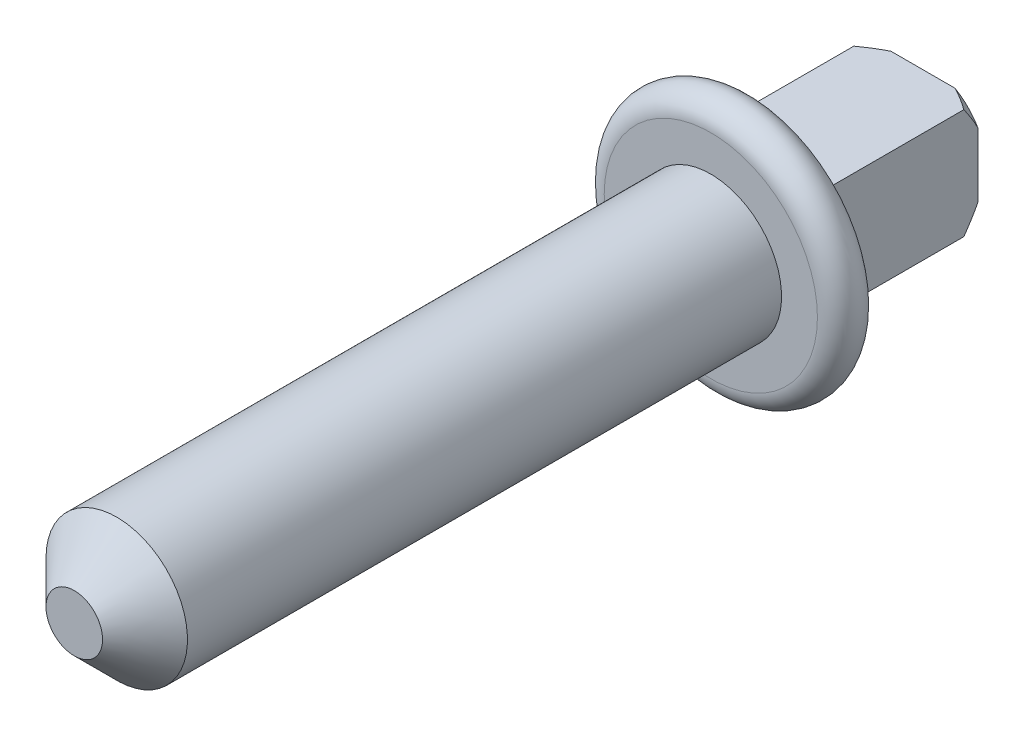
ISO-10303-21;
HEADER;
FILE_DESCRIPTION(('STEP AP214'),'2;1');
FILE_NAME('part.step','',(''),(''),'','','');
FILE_SCHEMA(('AUTOMOTIVE_DESIGN { 1 0 10303 214 1 1 1 1 }'));
ENDSEC;
DATA;
#1=APPLICATION_CONTEXT('core data for automotive mechanical design processes');
#2=APPLICATION_PROTOCOL_DEFINITION('international standard','automotive_design',2000,#1);
#3=PRODUCT_CONTEXT('',#1,'mechanical');
#4=PRODUCT('Part','Part','',(#3));
#5=PRODUCT_RELATED_PRODUCT_CATEGORY('part','',(#4));
#6=PRODUCT_DEFINITION_FORMATION('','',#4);
#7=PRODUCT_DEFINITION_CONTEXT('part definition',#1,'design');
#8=PRODUCT_DEFINITION('design','',#6,#7);
#9=PRODUCT_DEFINITION_SHAPE('','',#8);
#10=(LENGTH_UNIT() NAMED_UNIT(*) SI_UNIT(.MILLI.,.METRE.));
#11=(NAMED_UNIT(*) PLANE_ANGLE_UNIT() SI_UNIT($,.RADIAN.));
#12=(NAMED_UNIT(*) SI_UNIT($,.STERADIAN.) SOLID_ANGLE_UNIT());
#13=UNCERTAINTY_MEASURE_WITH_UNIT(LENGTH_MEASURE(1.E-05),#10,'distance_accuracy_value','');
#14=(GEOMETRIC_REPRESENTATION_CONTEXT(3) GLOBAL_UNCERTAINTY_ASSIGNED_CONTEXT((#13)) GLOBAL_UNIT_ASSIGNED_CONTEXT((#10,
#11,#12)) REPRESENTATION_CONTEXT('',''));
#15=CARTESIAN_POINT('',(0.,0.,0.));
#16=DIRECTION('',(0.,0.,1.));
#17=DIRECTION('',(1.,0.,0.));
#18=AXIS2_PLACEMENT_3D('',#15,#16,#17);
#19=CARTESIAN_POINT('',(0.,0.,1.49954257660824));
#20=DIRECTION('',(0.,0.,-1.));
#21=DIRECTION('',(-1.,0.,0.));
#22=AXIS2_PLACEMENT_3D('',#19,#20,#21);
#23=TOROIDAL_SURFACE('',#22,7.53704134094666,1.5);
#24=CARTESIAN_POINT('',(0.,0.,0.));
#25=DIRECTION('',(0.,0.,1.));
#26=DIRECTION('',(1.,0.,0.));
#27=AXIS2_PLACEMENT_3D('',#24,#25,#26);
#28=CIRCLE('',#27,7.57408268189333);
#29=CARTESIAN_POINT('',(7.57408268189333,0.,0.));
#30=VERTEX_POINT('',#29);
#31=EDGE_CURVE('E150',#30,#30,#28,.T.);
#32=ORIENTED_EDGE('',*,*,#31,.T.);
#33=EDGE_LOOP('',(#32));
#34=FACE_BOUND('',#33,.T.);
#35=CARTESIAN_POINT('',(0.,0.,2.99954257660824));
#36=DIRECTION('',(0.,0.,-1.));
#37=DIRECTION('',(-1.,0.,0.));
#38=AXIS2_PLACEMENT_3D('',#35,#36,#37);
#39=CIRCLE('',#38,7.53704134094666);
#40=CARTESIAN_POINT('',(-7.53704134094666,0.,2.99954257660824));
#41=VERTEX_POINT('',#40);
#42=EDGE_CURVE('E160',#41,#41,#39,.T.);
#43=ORIENTED_EDGE('',*,*,#42,.T.);
#44=EDGE_LOOP('',(#43));
#45=FACE_BOUND('',#44,.T.);
#46=ADVANCED_FACE('F50',(#34,#45),#23,.T.);
#47=CARTESIAN_POINT('',(0.,0.,48.));
#48=DIRECTION('',(0.,0.,-1.));
#49=DIRECTION('',(-1.,0.,0.));
#50=AXIS2_PLACEMENT_3D('',#47,#48,#49);
#51=PLANE('',#50);
#52=CARTESIAN_POINT('',(0.,0.,48.));
#53=DIRECTION('',(0.,0.,-1.));
#54=DIRECTION('',(-1.,0.,0.));
#55=AXIS2_PLACEMENT_3D('',#52,#53,#54);
#56=CIRCLE('',#55,2.00000000000001);
#57=CARTESIAN_POINT('',(-2.00000000000001,0.,48.));
#58=VERTEX_POINT('',#57);
#59=EDGE_CURVE('E169',#58,#58,#56,.T.);
#60=ORIENTED_EDGE('',*,*,#59,.F.);
#61=EDGE_LOOP('',(#60));
#62=FACE_BOUND('',#61,.T.);
#63=ADVANCED_FACE('F244',(#62),#51,.F.);
#64=CARTESIAN_POINT('',(0.,0.,48.));
#65=DIRECTION('',(0.,0.,-1.));
#66=DIRECTION('',(-1.,0.,0.));
#67=AXIS2_PLACEMENT_3D('',#64,#65,#66);
#68=CONICAL_SURFACE('',#67,2.00000000000001,0.785398163397446);
#69=CARTESIAN_POINT('',(0.,0.,45.));
#70=DIRECTION('',(0.,0.,-1.));
#71=DIRECTION('',(-1.,0.,0.));
#72=AXIS2_PLACEMENT_3D('',#69,#70,#71);
#73=CIRCLE('',#72,5.);
#74=CARTESIAN_POINT('',(-4.99999999999999,0.,45.));
#75=VERTEX_POINT('',#74);
#76=EDGE_CURVE('E166',#75,#75,#73,.T.);
#77=ORIENTED_EDGE('',*,*,#76,.F.);
#78=EDGE_LOOP('',(#77));
#79=FACE_BOUND('',#78,.T.);
#80=ORIENTED_EDGE('',*,*,#59,.T.);
#81=EDGE_LOOP('',(#80));
#82=FACE_BOUND('',#81,.T.);
#83=ADVANCED_FACE('F249',(#79,#82),#68,.T.);
#84=CARTESIAN_POINT('',(0.,0.,0.));
#85=DIRECTION('',(0.,0.,-1.));
#86=DIRECTION('',(-1.,0.,0.));
#87=AXIS2_PLACEMENT_3D('',#84,#85,#86);
#88=CYLINDRICAL_SURFACE('',#87,5.);
#89=CARTESIAN_POINT('',(0.,0.,2.99954257660824));
#90=DIRECTION('',(0.,0.,-1.));
#91=DIRECTION('',(-1.,0.,0.));
#92=AXIS2_PLACEMENT_3D('',#89,#90,#91);
#93=CIRCLE('',#92,4.99999999999999);
#94=CARTESIAN_POINT('',(-4.99999999999999,0.,2.99954257660824));
#95=VERTEX_POINT('',#94);
#96=EDGE_CURVE('E163',#95,#95,#93,.T.);
#97=ORIENTED_EDGE('',*,*,#96,.F.);
#98=EDGE_LOOP('',(#97));
#99=FACE_BOUND('',#98,.T.);
#100=ORIENTED_EDGE('',*,*,#76,.T.);
#101=EDGE_LOOP('',(#100));
#102=FACE_BOUND('',#101,.T.);
#103=ADVANCED_FACE('F259',(#99,#102),#88,.T.);
#104=CARTESIAN_POINT('',(-4.99999999999999,0.,2.99954257660824));
#105=DIRECTION('',(0.,0.,-1.));
#106=DIRECTION('',(-1.,0.,0.));
#107=AXIS2_PLACEMENT_3D('',#104,#105,#106);
#108=PLANE('',#107);
#109=ORIENTED_EDGE('',*,*,#42,.F.);
#110=EDGE_LOOP('',(#109));
#111=FACE_BOUND('',#110,.T.);
#112=ORIENTED_EDGE('',*,*,#96,.T.);
#113=EDGE_LOOP('',(#112));
#114=FACE_BOUND('',#113,.T.);
#115=ADVANCED_FACE('F255',(#111,#114),#108,.F.);
#116=CARTESIAN_POINT('',(-7.5,0.,0.));
#117=DIRECTION('',(0.,0.,1.));
#118=DIRECTION('',(1.,0.,0.));
#119=AXIS2_PLACEMENT_3D('',#116,#117,#118);
#120=PLANE('',#119);
#121=DIRECTION('',(0.,-1.,0.));
#122=VECTOR('',#121,1.);
#123=CARTESIAN_POINT('',(3.88908729652601,3.88908729652601,0.));
#124=LINE('',#123,#122);
#125=CARTESIAN_POINT('',(3.88908729652601,3.88908729652601,0.));
#126=VERTEX_POINT('',#125);
#127=CARTESIAN_POINT('',(3.88908729652601,-3.88908729652601,0.));
#128=VERTEX_POINT('',#127);
#129=EDGE_CURVE('E137',#126,#128,#124,.T.);
#130=ORIENTED_EDGE('',*,*,#129,.F.);
#131=DIRECTION('',(1.,0.,0.));
#132=VECTOR('',#131,1.);
#133=CARTESIAN_POINT('',(3.88908729652601,3.88908729652601,0.));
#134=LINE('',#133,#132);
#135=CARTESIAN_POINT('',(-3.88908729652601,3.88908729652601,0.));
#136=VERTEX_POINT('',#135);
#137=EDGE_CURVE('E74',#136,#126,#134,.T.);
#138=ORIENTED_EDGE('',*,*,#137,.F.);
#139=DIRECTION('',(0.,1.,0.));
#140=VECTOR('',#139,1.);
#141=CARTESIAN_POINT('',(-3.88908729652601,3.88908729652601,0.));
#142=LINE('',#141,#140);
#143=CARTESIAN_POINT('',(-3.88908729652601,-3.88908729652601,0.));
#144=VERTEX_POINT('',#143);
#145=EDGE_CURVE('E134',#144,#136,#142,.T.);
#146=ORIENTED_EDGE('',*,*,#145,.F.);
#147=DIRECTION('',(-1.,0.,0.));
#148=VECTOR('',#147,1.);
#149=CARTESIAN_POINT('',(3.88908729652601,-3.88908729652601,0.));
#150=LINE('',#149,#148);
#151=EDGE_CURVE('E143',#128,#144,#150,.T.);
#152=ORIENTED_EDGE('',*,*,#151,.F.);
#153=EDGE_LOOP('',(#130,#138,#146,#152));
#154=FACE_BOUND('',#153,.T.);
#155=ORIENTED_EDGE('',*,*,#31,.F.);
#156=EDGE_LOOP('',(#155));
#157=FACE_BOUND('',#156,.T.);
#158=ADVANCED_FACE('F132',(#154,#157),#120,.F.);
#159=CARTESIAN_POINT('',(3.88908729652601,3.88908729652601,25.8162189847481));
#160=DIRECTION('',(0.,1.,0.));
#161=DIRECTION('',(0.,0.,1.));
#162=AXIS2_PLACEMENT_3D('',#159,#160,#161);
#163=PLANE('',#162);
#164=DIRECTION('',(0.,0.,-1.));
#165=VECTOR('',#164,1.);
#166=CARTESIAN_POINT('',(-3.88908729652601,3.88908729652601,25.8162189847481));
#167=LINE('',#166,#165);
#168=CARTESIAN_POINT('',(-3.88908729652601,3.88908729652601,-11.));
#169=VERTEX_POINT('',#168);
#170=EDGE_CURVE('E121',#136,#169,#167,.T.);
#171=ORIENTED_EDGE('',*,*,#170,.F.);
#172=ORIENTED_EDGE('',*,*,#137,.T.);
#173=DIRECTION('',(0.,0.,-1.));
#174=VECTOR('',#173,1.);
#175=CARTESIAN_POINT('',(3.88908729652601,3.88908729652601,25.8162189847481));
#176=LINE('',#175,#174);
#177=CARTESIAN_POINT('',(3.88908729652601,3.88908729652601,-11.));
#178=VERTEX_POINT('',#177);
#179=EDGE_CURVE('E79',#126,#178,#176,.T.);
#180=ORIENTED_EDGE('',*,*,#179,.T.);
#181=CARTESIAN_POINT('',(-3.88978729652601,3.88908729652601,-10.9995050029824));
#182=CARTESIAN_POINT('',(-3.78108369336855,3.88908729652601,-11.0763519078416));
#183=CARTESIAN_POINT('',(-3.67163260877479,3.88908729652601,-11.1521649922041));
#184=CARTESIAN_POINT('',(-3.45093033281997,3.88908729652601,-11.3012287873298));
#185=CARTESIAN_POINT('',(-3.33967835451337,3.88908729652601,-11.3744783311237));
#186=CARTESIAN_POINT('',(-3.11376459857949,3.88908729652601,-11.5187454667472));
#187=CARTESIAN_POINT('',(-2.99907758942493,3.88908729652601,-11.5897237645149));
#188=CARTESIAN_POINT('',(-2.76736027517317,3.88908729652601,-11.727724627306));
#189=CARTESIAN_POINT('',(-2.65033023979367,3.88908729652601,-11.7947476441753));
#190=CARTESIAN_POINT('',(-2.40987073792604,3.88908729652601,-11.9259406979572));
#191=CARTESIAN_POINT('',(-2.28635560527038,3.88908729652601,-11.9899559053949));
#192=CARTESIAN_POINT('',(-2.03618307879466,3.88908729652601,-12.1114857471477));
#193=CARTESIAN_POINT('',(-1.9095250936363,3.88908729652601,-12.1689991466409));
#194=CARTESIAN_POINT('',(-1.525608164993,3.88908729652601,-12.3288271806211));
#195=CARTESIAN_POINT('',(-1.26295503167271,3.88908729652601,-12.4192622779044));
#196=CARTESIAN_POINT('',(-0.867412663725976,3.88908729652601,-12.5172571812076));
#197=CARTESIAN_POINT('',(-0.739063924774483,3.88908729652601,-12.5433775346429));
#198=CARTESIAN_POINT('',(-0.480394446215664,3.88908729652601,-12.5834351359055));
#199=CARTESIAN_POINT('',(-0.350073282693113,3.88908729652601,-12.5973697258187));
#200=CARTESIAN_POINT('',(-0.0905175397892483,3.88908729652601,-12.6119873684757));
#201=CARTESIAN_POINT('',(0.0387066140747044,3.88908729652601,-12.6128536862105));
#202=CARTESIAN_POINT('',(0.296593475126116,3.88908729652601,-12.6017480484666));
#203=CARTESIAN_POINT('',(0.425256179667228,3.88908729652601,-12.5897760325409));
#204=CARTESIAN_POINT('',(0.679965963744885,3.88908729652601,-12.5539197818217));
#205=CARTESIAN_POINT('',(0.806025005448717,3.88908729652601,-12.5301188904681));
#206=CARTESIAN_POINT('',(1.05573497768834,3.88908729652601,-12.4719970012519));
#207=CARTESIAN_POINT('',(1.17938440235939,3.88908729652601,-12.4376696358967));
#208=CARTESIAN_POINT('',(1.42539134157302,3.88908729652601,-12.3595958129107));
#209=CARTESIAN_POINT('',(1.54771168374905,3.88908729652601,-12.315733694317));
#210=CARTESIAN_POINT('',(1.78932464784705,3.88908729652601,-12.2204721519484));
#211=CARTESIAN_POINT('',(1.90861770691972,3.88908729652601,-12.169073823779));
#212=CARTESIAN_POINT('',(2.19351522202659,3.88908729652601,-12.0374301943781));
#213=CARTESIAN_POINT('',(2.35768516455932,3.88908729652601,-11.9540939987656));
#214=CARTESIAN_POINT('',(2.68109944528291,3.88908729652601,-11.7782552552018));
#215=CARTESIAN_POINT('',(2.8403404830074,3.88908729652601,-11.6857467324143));
#216=CARTESIAN_POINT('',(3.14985005595836,3.88908729652601,-11.4968010585993));
#217=CARTESIAN_POINT('',(3.30024422234143,3.88908729652601,-11.4005684052412));
#218=CARTESIAN_POINT('',(3.52323025103755,3.88908729652601,-11.252612192772));
#219=CARTESIAN_POINT('',(3.59706112925623,3.88908729652601,-11.2027375542533));
#220=CARTESIAN_POINT('',(3.74396924633303,3.88908729652601,-11.1019023782328));
#221=CARTESIAN_POINT('',(3.81704654581192,3.88908729652601,-11.0509419291051));
#222=CARTESIAN_POINT('',(3.88978729652601,3.88908729652601,-10.9995050029824));
#223=B_SPLINE_CURVE_WITH_KNOTS('',3,(#181,#182,#183,#184,#185,#186,#187,#188,#189,#190,#191,
#192,#193,#194,#195,#196,#197,#198,#199,#200,#201,#202,#203,#204,#205,#206,#207,#208,#209,#210,
#211,#212,#213,#214,#215,#216,#217,#218,#219,#220,#221,#222),.UNSPECIFIED.,.F.,.F.,(4,2,2,2,2,2,
2,2,2,2,2,2,2,2,2,2,2,2,2,2,4),(0.,0.399384944315372,0.798949391548146,1.20350341944569,
1.60801114183076,2.02517246102459,2.44241287477624,3.27189771118466,3.66435868136198,
4.05690523234999,4.44394164406653,4.83097987808236,5.21532898974421,5.59991105538195,
5.98944824008372,6.37892885036908,6.93084202725827,7.48311711122266,8.01862763050061,
8.28591460136134,8.55317990021174),.UNSPECIFIED.);
#224=CARTESIAN_POINT('',(2.26384628453435,3.88908729652601,-12.));
#225=VERTEX_POINT('',#224);
#226=EDGE_CURVE('E176',#225,#178,#223,.T.);
#227=ORIENTED_EDGE('',*,*,#226,.F.);
#228=DIRECTION('',(1.,0.,0.));
#229=VECTOR('',#228,1.);
#230=CARTESIAN_POINT('',(3.88908729652601,3.88908729652601,-12.));
#231=LINE('',#230,#229);
#232=CARTESIAN_POINT('',(-2.26384628453435,3.88908729652601,-12.));
#233=VERTEX_POINT('',#232);
#234=EDGE_CURVE('E128',#233,#225,#231,.T.);
#235=ORIENTED_EDGE('',*,*,#234,.F.);
#236=EDGE_CURVE('E124',#169,#233,#223,.T.);
#237=ORIENTED_EDGE('',*,*,#236,.F.);
#238=EDGE_LOOP('',(#171,#172,#180,#227,#235,#237));
#239=FACE_BOUND('',#238,.T.);
#240=ADVANCED_FACE('F122',(#239),#163,.T.);
#241=CARTESIAN_POINT('',(3.88908729652601,3.88908729652601,25.8162189847481));
#242=DIRECTION('',(1.,0.,0.));
#243=DIRECTION('',(0.,0.,-1.));
#244=AXIS2_PLACEMENT_3D('',#241,#242,#243);
#245=PLANE('',#244);
#246=ORIENTED_EDGE('',*,*,#179,.F.);
#247=ORIENTED_EDGE('',*,*,#129,.T.);
#248=DIRECTION('',(0.,0.,-1.));
#249=VECTOR('',#248,1.);
#250=CARTESIAN_POINT('',(3.88908729652601,-3.88908729652601,25.8162189847481));
#251=LINE('',#250,#249);
#252=CARTESIAN_POINT('',(3.88908729652601,-3.88908729652601,-11.));
#253=VERTEX_POINT('',#252);
#254=EDGE_CURVE('E153',#128,#253,#251,.T.);
#255=ORIENTED_EDGE('',*,*,#254,.T.);
#256=CARTESIAN_POINT('',(3.88908729652601,3.88978729652601,-10.9995050029824));
#257=CARTESIAN_POINT('',(3.88908729652601,3.78108369336854,-11.0763519078416));
#258=CARTESIAN_POINT('',(3.88908729652601,3.67163260877478,-11.1521649922041));
#259=CARTESIAN_POINT('',(3.88908729652601,3.45093033281996,-11.3012287873298));
#260=CARTESIAN_POINT('',(3.88908729652601,3.33967835451337,-11.3744783311237));
#261=CARTESIAN_POINT('',(3.88908729652601,3.11376459857949,-11.5187454667472));
#262=CARTESIAN_POINT('',(3.88908729652601,2.99907758942493,-11.5897237645149));
#263=CARTESIAN_POINT('',(3.88908729652601,2.76736027517317,-11.727724627306));
#264=CARTESIAN_POINT('',(3.88908729652601,2.65033023979366,-11.7947476441753));
#265=CARTESIAN_POINT('',(3.88908729652601,2.40987073792604,-11.9259406979572));
#266=CARTESIAN_POINT('',(3.88908729652601,2.28635560527038,-11.9899559053949));
#267=CARTESIAN_POINT('',(3.88908729652601,2.03618307879466,-12.1114857471477));
#268=CARTESIAN_POINT('',(3.88908729652601,1.9095250936363,-12.1689991466409));
#269=CARTESIAN_POINT('',(3.88908729652601,1.52560816499299,-12.3288271806211));
#270=CARTESIAN_POINT('',(3.88908729652601,1.26295503167271,-12.4192622779044));
#271=CARTESIAN_POINT('',(3.88908729652601,0.867412663725975,-12.5172571812076));
#272=CARTESIAN_POINT('',(3.88908729652601,0.739063924774482,-12.5433775346429));
#273=CARTESIAN_POINT('',(3.88908729652601,0.480394446215663,-12.5834351359055));
#274=CARTESIAN_POINT('',(3.88908729652601,0.350073282693111,-12.5973697258187));
#275=CARTESIAN_POINT('',(3.88908729652601,0.0905175397892465,-12.6119873684757));
#276=CARTESIAN_POINT('',(3.88908729652601,-0.0387066140747065,-12.6128536862105));
#277=CARTESIAN_POINT('',(3.88908729652601,-0.296593475126118,-12.6017480484666));
#278=CARTESIAN_POINT('',(3.88908729652601,-0.42525617966723,-12.5897760325409));
#279=CARTESIAN_POINT('',(3.88908729652601,-0.679965963744886,-12.5539197818217));
#280=CARTESIAN_POINT('',(3.88908729652601,-0.806025005448718,-12.5301188904681));
#281=CARTESIAN_POINT('',(3.88908729652601,-1.05573497768834,-12.4719970012519));
#282=CARTESIAN_POINT('',(3.88908729652601,-1.17938440235939,-12.4376696358967));
#283=CARTESIAN_POINT('',(3.88908729652601,-1.42539134157302,-12.3595958129108));
#284=CARTESIAN_POINT('',(3.88908729652601,-1.54771168374905,-12.315733694317));
#285=CARTESIAN_POINT('',(3.88908729652601,-1.78932464784705,-12.2204721519484));
#286=CARTESIAN_POINT('',(3.88908729652601,-1.90861770691972,-12.169073823779));
#287=CARTESIAN_POINT('',(3.88908729652601,-2.19351522202659,-12.0374301943781));
#288=CARTESIAN_POINT('',(3.88908729652601,-2.35768516455932,-11.9540939987656));
#289=CARTESIAN_POINT('',(3.88908729652601,-2.68109944528292,-11.7782552552018));
#290=CARTESIAN_POINT('',(3.88908729652601,-2.8403404830074,-11.6857467324143));
#291=CARTESIAN_POINT('',(3.88908729652601,-3.14985005595837,-11.4968010585993));
#292=CARTESIAN_POINT('',(3.88908729652601,-3.30024422234143,-11.4005684052412));
#293=CARTESIAN_POINT('',(3.88908729652601,-3.52323025103755,-11.252612192772));
#294=CARTESIAN_POINT('',(3.88908729652601,-3.59706112925623,-11.2027375542533));
#295=CARTESIAN_POINT('',(3.88908729652601,-3.74396924633303,-11.1019023782328));
#296=CARTESIAN_POINT('',(3.88908729652601,-3.81704654581192,-11.0509419291051));
#297=CARTESIAN_POINT('',(3.88908729652601,-3.88978729652601,-10.9995050029824));
#298=B_SPLINE_CURVE_WITH_KNOTS('',3,(#256,#257,#258,#259,#260,#261,#262,#263,#264,#265,#266,
#267,#268,#269,#270,#271,#272,#273,#274,#275,#276,#277,#278,#279,#280,#281,#282,#283,#284,#285,
#286,#287,#288,#289,#290,#291,#292,#293,#294,#295,#296,#297),.UNSPECIFIED.,.F.,.F.,(4,2,2,2,2,2,
2,2,2,2,2,2,2,2,2,2,2,2,2,2,4),(0.,0.399384944315371,0.798949391548146,1.20350341944569,
1.60801114183076,2.02517246102459,2.44241287477624,3.27189771118466,3.66435868136198,
4.05690523234999,4.44394164406653,4.83097987808236,5.2153289897442,5.59991105538195,
5.98944824008372,6.37892885036908,6.93084202725827,7.48311711122266,8.01862763050061,
8.28591460136134,8.55317990021174),.UNSPECIFIED.);
#299=CARTESIAN_POINT('',(3.88908729652601,-2.26384628453435,-12.));
#300=VERTEX_POINT('',#299);
#301=EDGE_CURVE('E212',#300,#253,#298,.T.);
#302=ORIENTED_EDGE('',*,*,#301,.F.);
#303=DIRECTION('',(0.,-1.,0.));
#304=VECTOR('',#303,1.);
#305=CARTESIAN_POINT('',(3.88908729652601,3.88908729652601,-12.));
#306=LINE('',#305,#304);
#307=CARTESIAN_POINT('',(3.88908729652601,2.26384628453435,-12.));
#308=VERTEX_POINT('',#307);
#309=EDGE_CURVE('E129',#308,#300,#306,.T.);
#310=ORIENTED_EDGE('',*,*,#309,.F.);
#311=EDGE_CURVE('E185',#178,#308,#298,.T.);
#312=ORIENTED_EDGE('',*,*,#311,.F.);
#313=EDGE_LOOP('',(#246,#247,#255,#302,#310,#312));
#314=FACE_BOUND('',#313,.T.);
#315=ADVANCED_FACE('F193',(#314),#245,.T.);
#316=CARTESIAN_POINT('',(3.88908729652601,-3.88908729652601,25.8162189847481));
#317=DIRECTION('',(0.,-1.,0.));
#318=DIRECTION('',(0.,0.,-1.));
#319=AXIS2_PLACEMENT_3D('',#316,#317,#318);
#320=PLANE('',#319);
#321=ORIENTED_EDGE('',*,*,#254,.F.);
#322=ORIENTED_EDGE('',*,*,#151,.T.);
#323=DIRECTION('',(0.,0.,-1.));
#324=VECTOR('',#323,1.);
#325=CARTESIAN_POINT('',(-3.88908729652601,-3.88908729652601,25.8162189847481));
#326=LINE('',#325,#324);
#327=CARTESIAN_POINT('',(-3.88908729652601,-3.88908729652601,-11.));
#328=VERTEX_POINT('',#327);
#329=EDGE_CURVE('E141',#144,#328,#326,.T.);
#330=ORIENTED_EDGE('',*,*,#329,.T.);
#331=CARTESIAN_POINT('',(3.88978729652601,-3.88908729652601,-10.9995050029824));
#332=CARTESIAN_POINT('',(3.78108369336854,-3.88908729652601,-11.0763519078416));
#333=CARTESIAN_POINT('',(3.67163260877478,-3.88908729652601,-11.1521649922041));
#334=CARTESIAN_POINT('',(3.45093033281996,-3.88908729652601,-11.3012287873298));
#335=CARTESIAN_POINT('',(3.33967835451337,-3.88908729652601,-11.3744783311237));
#336=CARTESIAN_POINT('',(3.11376459857949,-3.88908729652601,-11.5187454667472));
#337=CARTESIAN_POINT('',(2.99907758942492,-3.88908729652601,-11.5897237645149));
#338=CARTESIAN_POINT('',(2.76736027517317,-3.88908729652601,-11.727724627306));
#339=CARTESIAN_POINT('',(2.65033023979366,-3.88908729652601,-11.7947476441753));
#340=CARTESIAN_POINT('',(2.40987073792604,-3.88908729652601,-11.9259406979572));
#341=CARTESIAN_POINT('',(2.28635560527038,-3.88908729652601,-11.9899559053949));
#342=CARTESIAN_POINT('',(2.03618307879466,-3.88908729652601,-12.1114857471477));
#343=CARTESIAN_POINT('',(1.90952509363629,-3.88908729652601,-12.1689991466409));
#344=CARTESIAN_POINT('',(1.52560816499299,-3.88908729652601,-12.3288271806211));
#345=CARTESIAN_POINT('',(1.2629550316727,-3.88908729652601,-12.4192622779044));
#346=CARTESIAN_POINT('',(0.867412663725972,-3.88908729652601,-12.5172571812076));
#347=CARTESIAN_POINT('',(0.739063924774478,-3.88908729652601,-12.5433775346429));
#348=CARTESIAN_POINT('',(0.480394446215659,-3.88908729652601,-12.5834351359055));
#349=CARTESIAN_POINT('',(0.350073282693107,-3.88908729652601,-12.5973697258187));
#350=CARTESIAN_POINT('',(0.0905175397892425,-3.88908729652601,-12.6119873684756));
#351=CARTESIAN_POINT('',(-0.0387066140747102,-3.88908729652601,-12.6128536862105));
#352=CARTESIAN_POINT('',(-0.296593475126122,-3.88908729652601,-12.6017480484666));
#353=CARTESIAN_POINT('',(-0.425256179667234,-3.88908729652601,-12.5897760325409));
#354=CARTESIAN_POINT('',(-0.679965963744891,-3.88908729652601,-12.5539197818217));
#355=CARTESIAN_POINT('',(-0.806025005448722,-3.88908729652601,-12.5301188904681));
#356=CARTESIAN_POINT('',(-1.05573497768835,-3.88908729652601,-12.4719970012519));
#357=CARTESIAN_POINT('',(-1.1793844023594,-3.88908729652601,-12.4376696358967));
#358=CARTESIAN_POINT('',(-1.42539134157302,-3.88908729652601,-12.3595958129107));
#359=CARTESIAN_POINT('',(-1.54771168374905,-3.88908729652601,-12.315733694317));
#360=CARTESIAN_POINT('',(-1.78932464784706,-3.88908729652601,-12.2204721519484));
#361=CARTESIAN_POINT('',(-1.90861770691972,-3.88908729652601,-12.169073823779));
#362=CARTESIAN_POINT('',(-2.1935152220266,-3.88908729652601,-12.0374301943781));
#363=CARTESIAN_POINT('',(-2.35768516455932,-3.88908729652601,-11.9540939987656));
#364=CARTESIAN_POINT('',(-2.68109944528292,-3.88908729652601,-11.7782552552018));
#365=CARTESIAN_POINT('',(-2.84034048300741,-3.88908729652601,-11.6857467324143));
#366=CARTESIAN_POINT('',(-3.14985005595837,-3.88908729652601,-11.4968010585993));
#367=CARTESIAN_POINT('',(-3.30024422234144,-3.88908729652601,-11.4005684052412));
#368=CARTESIAN_POINT('',(-3.52323025103756,-3.88908729652601,-11.252612192772));
#369=CARTESIAN_POINT('',(-3.59706112925624,-3.88908729652601,-11.2027375542533));
#370=CARTESIAN_POINT('',(-3.74396924633303,-3.88908729652601,-11.1019023782328));
#371=CARTESIAN_POINT('',(-3.81704654581193,-3.88908729652601,-11.0509419291051));
#372=CARTESIAN_POINT('',(-3.88978729652601,-3.88908729652601,-10.9995050029824));
#373=B_SPLINE_CURVE_WITH_KNOTS('',3,(#331,#332,#333,#334,#335,#336,#337,#338,#339,#340,#341,
#342,#343,#344,#345,#346,#347,#348,#349,#350,#351,#352,#353,#354,#355,#356,#357,#358,#359,#360,
#361,#362,#363,#364,#365,#366,#367,#368,#369,#370,#371,#372),.UNSPECIFIED.,.F.,.F.,(4,2,2,2,2,2,
2,2,2,2,2,2,2,2,2,2,2,2,2,2,4),(0.,0.399384944315371,0.798949391548146,1.20350341944569,
1.60801114183076,2.02517246102459,2.44241287477624,3.27189771118466,3.66435868136198,
4.05690523234999,4.44394164406653,4.83097987808236,5.21532898974421,5.59991105538195,
5.98944824008372,6.37892885036908,6.93084202725827,7.48311711122266,8.01862763050061,
8.28591460136134,8.55317990021174),.UNSPECIFIED.);
#374=CARTESIAN_POINT('',(-2.26384628453435,-3.88908729652601,-12.));
#375=VERTEX_POINT('',#374);
#376=EDGE_CURVE('E66',#375,#328,#373,.T.);
#377=ORIENTED_EDGE('',*,*,#376,.F.);
#378=DIRECTION('',(-1.,0.,0.));
#379=VECTOR('',#378,1.);
#380=CARTESIAN_POINT('',(3.88908729652601,-3.88908729652601,-12.));
#381=LINE('',#380,#379);
#382=CARTESIAN_POINT('',(2.26384628453435,-3.88908729652601,-12.));
#383=VERTEX_POINT('',#382);
#384=EDGE_CURVE('E156',#383,#375,#381,.T.);
#385=ORIENTED_EDGE('',*,*,#384,.F.);
#386=EDGE_CURVE('E56',#253,#383,#373,.T.);
#387=ORIENTED_EDGE('',*,*,#386,.F.);
#388=EDGE_LOOP('',(#321,#322,#330,#377,#385,#387));
#389=FACE_BOUND('',#388,.T.);
#390=ADVANCED_FACE('F196',(#389),#320,.T.);
#391=CARTESIAN_POINT('',(-3.88908729652601,3.88908729652601,25.8162189847481));
#392=DIRECTION('',(-1.,0.,0.));
#393=DIRECTION('',(0.,0.,1.));
#394=AXIS2_PLACEMENT_3D('',#391,#392,#393);
#395=PLANE('',#394);
#396=ORIENTED_EDGE('',*,*,#329,.F.);
#397=ORIENTED_EDGE('',*,*,#145,.T.);
#398=ORIENTED_EDGE('',*,*,#170,.T.);
#399=CARTESIAN_POINT('',(-3.88908729652601,-3.88978729652601,-10.9995050029824));
#400=CARTESIAN_POINT('',(-3.88908729652601,-3.78108369336854,-11.0763519078416));
#401=CARTESIAN_POINT('',(-3.88908729652601,-3.67163260877478,-11.1521649922041));
#402=CARTESIAN_POINT('',(-3.88908729652601,-3.45093033281996,-11.3012287873298));
#403=CARTESIAN_POINT('',(-3.88908729652601,-3.33967835451337,-11.3744783311237));
#404=CARTESIAN_POINT('',(-3.88908729652601,-3.11376459857949,-11.5187454667472));
#405=CARTESIAN_POINT('',(-3.88908729652601,-2.99907758942493,-11.5897237645149));
#406=CARTESIAN_POINT('',(-3.88908729652601,-2.76736027517317,-11.727724627306));
#407=CARTESIAN_POINT('',(-3.88908729652601,-2.65033023979366,-11.7947476441753));
#408=CARTESIAN_POINT('',(-3.88908729652601,-2.40987073792604,-11.9259406979572));
#409=CARTESIAN_POINT('',(-3.88908729652601,-2.28635560527038,-11.9899559053949));
#410=CARTESIAN_POINT('',(-3.88908729652601,-2.03618307879466,-12.1114857471477));
#411=CARTESIAN_POINT('',(-3.88908729652601,-1.9095250936363,-12.1689991466409));
#412=CARTESIAN_POINT('',(-3.88908729652601,-1.52560816499299,-12.3288271806211));
#413=CARTESIAN_POINT('',(-3.88908729652601,-1.2629550316727,-12.4192622779044));
#414=CARTESIAN_POINT('',(-3.88908729652601,-0.867412663725973,-12.5172571812076));
#415=CARTESIAN_POINT('',(-3.88908729652601,-0.739063924774479,-12.5433775346429));
#416=CARTESIAN_POINT('',(-3.88908729652601,-0.48039444621566,-12.5834351359055));
#417=CARTESIAN_POINT('',(-3.88908729652601,-0.350073282693109,-12.5973697258187));
#418=CARTESIAN_POINT('',(-3.88908729652601,-0.0905175397892436,-12.6119873684756));
#419=CARTESIAN_POINT('',(-3.88908729652601,0.0387066140747093,-12.6128536862105));
#420=CARTESIAN_POINT('',(-3.88908729652601,0.296593475126121,-12.6017480484666));
#421=CARTESIAN_POINT('',(-3.88908729652601,0.425256179667233,-12.5897760325409));
#422=CARTESIAN_POINT('',(-3.88908729652601,0.67996596374489,-12.5539197818217));
#423=CARTESIAN_POINT('',(-3.88908729652601,0.806025005448722,-12.5301188904681));
#424=CARTESIAN_POINT('',(-3.88908729652601,1.05573497768835,-12.4719970012519));
#425=CARTESIAN_POINT('',(-3.88908729652601,1.1793844023594,-12.4376696358967));
#426=CARTESIAN_POINT('',(-3.88908729652601,1.42539134157302,-12.3595958129107));
#427=CARTESIAN_POINT('',(-3.88908729652601,1.54771168374905,-12.315733694317));
#428=CARTESIAN_POINT('',(-3.88908729652601,1.78932464784706,-12.2204721519484));
#429=CARTESIAN_POINT('',(-3.88908729652601,1.90861770691972,-12.169073823779));
#430=CARTESIAN_POINT('',(-3.88908729652601,2.1935152220266,-12.0374301943781));
#431=CARTESIAN_POINT('',(-3.88908729652601,2.35768516455932,-11.9540939987656));
#432=CARTESIAN_POINT('',(-3.88908729652601,2.68109944528292,-11.7782552552018));
#433=CARTESIAN_POINT('',(-3.88908729652601,2.8403404830074,-11.6857467324143));
#434=CARTESIAN_POINT('',(-3.88908729652601,3.14985005595837,-11.4968010585993));
#435=CARTESIAN_POINT('',(-3.88908729652601,3.30024422234143,-11.4005684052412));
#436=CARTESIAN_POINT('',(-3.88908729652601,3.52323025103755,-11.252612192772));
#437=CARTESIAN_POINT('',(-3.88908729652601,3.59706112925623,-11.2027375542533));
#438=CARTESIAN_POINT('',(-3.88908729652601,3.74396924633303,-11.1019023782328));
#439=CARTESIAN_POINT('',(-3.88908729652601,3.81704654581192,-11.0509419291051));
#440=CARTESIAN_POINT('',(-3.88908729652601,3.88978729652601,-10.9995050029824));
#441=B_SPLINE_CURVE_WITH_KNOTS('',3,(#399,#400,#401,#402,#403,#404,#405,#406,#407,#408,#409,
#410,#411,#412,#413,#414,#415,#416,#417,#418,#419,#420,#421,#422,#423,#424,#425,#426,#427,#428,
#429,#430,#431,#432,#433,#434,#435,#436,#437,#438,#439,#440),.UNSPECIFIED.,.F.,.F.,(4,2,2,2,2,2,
2,2,2,2,2,2,2,2,2,2,2,2,2,2,4),(0.,0.399384944315372,0.798949391548145,1.20350341944569,
1.60801114183076,2.02517246102459,2.44241287477624,3.27189771118466,3.66435868136198,
4.05690523234999,4.44394164406653,4.83097987808236,5.21532898974421,5.59991105538196,
5.98944824008373,6.37892885036908,6.93084202725827,7.48311711122266,8.01862763050061,
8.28591460136134,8.55317990021174),.UNSPECIFIED.);
#442=CARTESIAN_POINT('',(-3.88908729652601,2.26384628453434,-12.));
#443=VERTEX_POINT('',#442);
#444=EDGE_CURVE('E67',#443,#169,#441,.T.);
#445=ORIENTED_EDGE('',*,*,#444,.F.);
#446=DIRECTION('',(0.,1.,0.));
#447=VECTOR('',#446,1.);
#448=CARTESIAN_POINT('',(-3.88908729652601,3.88908729652601,-12.));
#449=LINE('',#448,#447);
#450=CARTESIAN_POINT('',(-3.88908729652601,-2.26384628453434,-12.));
#451=VERTEX_POINT('',#450);
#452=EDGE_CURVE('E147',#451,#443,#449,.T.);
#453=ORIENTED_EDGE('',*,*,#452,.F.);
#454=EDGE_CURVE('E12',#328,#451,#441,.T.);
#455=ORIENTED_EDGE('',*,*,#454,.F.);
#456=EDGE_LOOP('',(#396,#397,#398,#445,#453,#455));
#457=FACE_BOUND('',#456,.T.);
#458=ADVANCED_FACE('F139',(#457),#395,.T.);
#459=CARTESIAN_POINT('',(0.,0.,-12.));
#460=DIRECTION('',(0.,0.,1.));
#461=DIRECTION('',(1.,0.,0.));
#462=AXIS2_PLACEMENT_3D('',#459,#460,#461);
#463=CONICAL_SURFACE('',#462,4.5,0.785398163397446);
#464=ORIENTED_EDGE('',*,*,#301,.T.);
#465=ORIENTED_EDGE('',*,*,#386,.T.);
#466=CARTESIAN_POINT('',(0.,0.,-12.));
#467=DIRECTION('',(0.,0.,-1.));
#468=DIRECTION('',(-1.,0.,0.));
#469=AXIS2_PLACEMENT_3D('',#466,#467,#468);
#470=CIRCLE('',#469,4.5);
#471=EDGE_CURVE('E227',#300,#383,#470,.T.);
#472=ORIENTED_EDGE('',*,*,#471,.F.);
#473=EDGE_LOOP('',(#464,#465,#472));
#474=FACE_BOUND('',#473,.T.);
#475=ADVANCED_FACE('F205',(#474),#463,.T.);
#476=ORIENTED_EDGE('',*,*,#226,.T.);
#477=ORIENTED_EDGE('',*,*,#311,.T.);
#478=EDGE_CURVE('E177',#225,#308,#470,.T.);
#479=ORIENTED_EDGE('',*,*,#478,.F.);
#480=EDGE_LOOP('',(#476,#477,#479));
#481=FACE_BOUND('',#480,.T.);
#482=ADVANCED_FACE('F220',(#481),#463,.T.);
#483=EDGE_CURVE('E173',#443,#233,#470,.T.);
#484=ORIENTED_EDGE('',*,*,#483,.F.);
#485=ORIENTED_EDGE('',*,*,#444,.T.);
#486=ORIENTED_EDGE('',*,*,#236,.T.);
#487=EDGE_LOOP('',(#484,#485,#486));
#488=FACE_BOUND('',#487,.T.);
#489=ADVANCED_FACE('F237',(#488),#463,.T.);
#490=ORIENTED_EDGE('',*,*,#376,.T.);
#491=ORIENTED_EDGE('',*,*,#454,.T.);
#492=EDGE_CURVE('E172',#375,#451,#470,.T.);
#493=ORIENTED_EDGE('',*,*,#492,.F.);
#494=EDGE_LOOP('',(#490,#491,#493));
#495=FACE_BOUND('',#494,.T.);
#496=ADVANCED_FACE('F53',(#495),#463,.T.);
#497=CARTESIAN_POINT('',(0.,0.,-12.));
#498=DIRECTION('',(0.,0.,-1.));
#499=DIRECTION('',(-1.,0.,0.));
#500=AXIS2_PLACEMENT_3D('',#497,#498,#499);
#501=PLANE('',#500);
#502=ORIENTED_EDGE('',*,*,#492,.T.);
#503=ORIENTED_EDGE('',*,*,#452,.T.);
#504=ORIENTED_EDGE('',*,*,#483,.T.);
#505=ORIENTED_EDGE('',*,*,#234,.T.);
#506=ORIENTED_EDGE('',*,*,#478,.T.);
#507=ORIENTED_EDGE('',*,*,#309,.T.);
#508=ORIENTED_EDGE('',*,*,#471,.T.);
#509=ORIENTED_EDGE('',*,*,#384,.T.);
#510=EDGE_LOOP('',(#502,#503,#504,#505,#506,#507,#508,#509));
#511=FACE_BOUND('',#510,.T.);
#512=ADVANCED_FACE('F206',(#511),#501,.T.);
#513=CLOSED_SHELL('',(#46,#63,#83,#103,#115,#158,#240,#315,#390,#458,#475,#482,#489,#496,#512));
#514=MANIFOLD_SOLID_BREP('B2',#513);
#515=ADVANCED_BREP_SHAPE_REPRESENTATION('',(#18,#514),#14);
#516=SHAPE_DEFINITION_REPRESENTATION(#9,#515);
ENDSEC;
END-ISO-10303-21;
